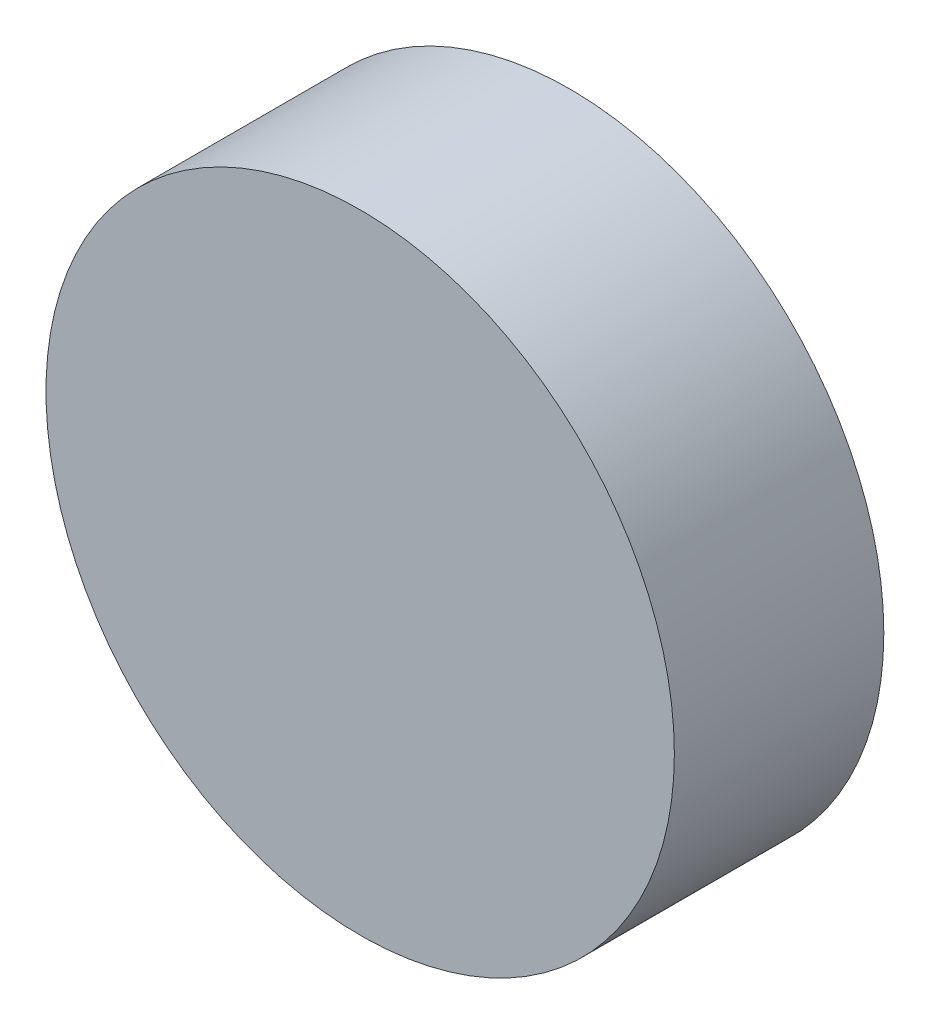
ISO-10303-21;
HEADER;
FILE_DESCRIPTION(('STEP AP214'),'2;1');
FILE_NAME('part.step','',(''),(''),'','','');
FILE_SCHEMA(('AUTOMOTIVE_DESIGN { 1 0 10303 214 1 1 1 1 }'));
ENDSEC;
DATA;
#1=APPLICATION_CONTEXT('core data for automotive mechanical design processes');
#2=APPLICATION_PROTOCOL_DEFINITION('international standard','automotive_design',2000,#1);
#3=PRODUCT_CONTEXT('',#1,'mechanical');
#4=PRODUCT('Part','Part','',(#3));
#5=PRODUCT_RELATED_PRODUCT_CATEGORY('part','',(#4));
#6=PRODUCT_DEFINITION_FORMATION('','',#4);
#7=PRODUCT_DEFINITION_CONTEXT('part definition',#1,'design');
#8=PRODUCT_DEFINITION('design','',#6,#7);
#9=PRODUCT_DEFINITION_SHAPE('','',#8);
#10=(LENGTH_UNIT() NAMED_UNIT(*) SI_UNIT(.MILLI.,.METRE.));
#11=(NAMED_UNIT(*) PLANE_ANGLE_UNIT() SI_UNIT($,.RADIAN.));
#12=(NAMED_UNIT(*) SI_UNIT($,.STERADIAN.) SOLID_ANGLE_UNIT());
#13=UNCERTAINTY_MEASURE_WITH_UNIT(LENGTH_MEASURE(1.E-05),#10,'distance_accuracy_value','');
#14=(GEOMETRIC_REPRESENTATION_CONTEXT(3) GLOBAL_UNCERTAINTY_ASSIGNED_CONTEXT((#13)) GLOBAL_UNIT_ASSIGNED_CONTEXT((#10,
#11,#12)) REPRESENTATION_CONTEXT('',''));
#15=CARTESIAN_POINT('',(0.,0.,0.));
#16=DIRECTION('',(0.,0.,1.));
#17=DIRECTION('',(1.,0.,0.));
#18=AXIS2_PLACEMENT_3D('',#15,#16,#17);
#19=CARTESIAN_POINT('',(0.,0.,3.5));
#20=DIRECTION('',(0.,0.,-1.));
#21=DIRECTION('',(-1.,0.,0.));
#22=AXIS2_PLACEMENT_3D('',#19,#20,#21);
#23=CYLINDRICAL_SURFACE('',#22,5.25);
#24=CARTESIAN_POINT('',(0.,0.,3.5));
#25=DIRECTION('',(0.,0.,1.));
#26=DIRECTION('',(1.,0.,0.));
#27=AXIS2_PLACEMENT_3D('',#24,#25,#26);
#28=CIRCLE('',#27,5.25);
#29=CARTESIAN_POINT('',(5.25,0.,3.5));
#30=VERTEX_POINT('',#29);
#31=EDGE_CURVE('E10',#30,#30,#28,.T.);
#32=ORIENTED_EDGE('',*,*,#31,.F.);
#33=EDGE_LOOP('',(#32));
#34=FACE_BOUND('',#33,.T.);
#35=CARTESIAN_POINT('',(0.,0.,0.));
#36=DIRECTION('',(0.,0.,1.));
#37=DIRECTION('',(1.,0.,0.));
#38=AXIS2_PLACEMENT_3D('',#35,#36,#37);
#39=CIRCLE('',#38,5.25);
#40=CARTESIAN_POINT('',(5.25,0.,0.));
#41=VERTEX_POINT('',#40);
#42=EDGE_CURVE('E34',#41,#41,#39,.T.);
#43=ORIENTED_EDGE('',*,*,#42,.T.);
#44=EDGE_LOOP('',(#43));
#45=FACE_BOUND('',#44,.T.);
#46=ADVANCED_FACE('F31',(#34,#45),#23,.T.);
#47=CARTESIAN_POINT('',(0.,0.,3.5));
#48=DIRECTION('',(0.,0.,1.));
#49=DIRECTION('',(1.,0.,0.));
#50=AXIS2_PLACEMENT_3D('',#47,#48,#49);
#51=PLANE('',#50);
#52=ORIENTED_EDGE('',*,*,#31,.T.);
#53=EDGE_LOOP('',(#52));
#54=FACE_BOUND('',#53,.T.);
#55=ADVANCED_FACE('F46',(#54),#51,.T.);
#56=CARTESIAN_POINT('',(0.,0.,0.));
#57=DIRECTION('',(0.,0.,1.));
#58=DIRECTION('',(1.,0.,0.));
#59=AXIS2_PLACEMENT_3D('',#56,#57,#58);
#60=PLANE('',#59);
#61=ORIENTED_EDGE('',*,*,#42,.F.);
#62=EDGE_LOOP('',(#61));
#63=FACE_BOUND('',#62,.T.);
#64=ADVANCED_FACE('F44',(#63),#60,.F.);
#65=CLOSED_SHELL('',(#46,#55,#64));
#66=MANIFOLD_SOLID_BREP('B2',#65);
#67=ADVANCED_BREP_SHAPE_REPRESENTATION('',(#18,#66),#14);
#68=SHAPE_DEFINITION_REPRESENTATION(#9,#67);
ENDSEC;
END-ISO-10303-21;
